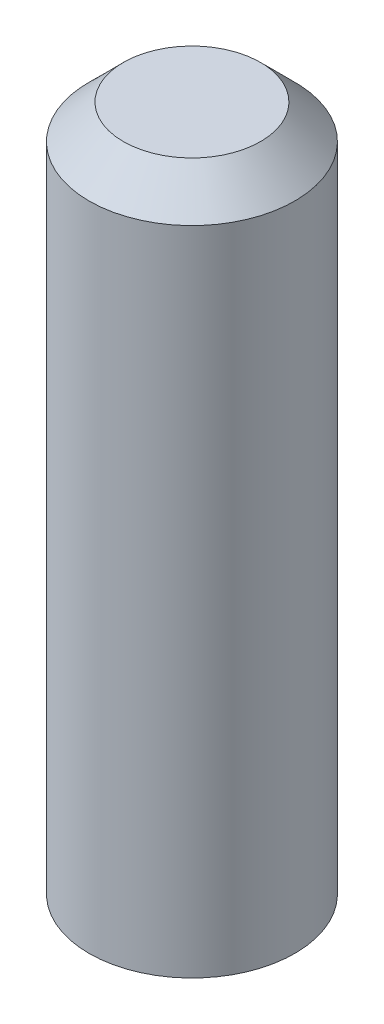
ISO-10303-21;
HEADER;
FILE_DESCRIPTION(('STEP AP214'),'2;1');
FILE_NAME('part.step','',(''),(''),'','','');
FILE_SCHEMA(('AUTOMOTIVE_DESIGN { 1 0 10303 214 1 1 1 1 }'));
ENDSEC;
DATA;
#1=APPLICATION_CONTEXT('core data for automotive mechanical design processes');
#2=APPLICATION_PROTOCOL_DEFINITION('international standard','automotive_design',2000,#1);
#3=PRODUCT_CONTEXT('',#1,'mechanical');
#4=PRODUCT('Part','Part','',(#3));
#5=PRODUCT_RELATED_PRODUCT_CATEGORY('part','',(#4));
#6=PRODUCT_DEFINITION_FORMATION('','',#4);
#7=PRODUCT_DEFINITION_CONTEXT('part definition',#1,'design');
#8=PRODUCT_DEFINITION('design','',#6,#7);
#9=PRODUCT_DEFINITION_SHAPE('','',#8);
#10=(LENGTH_UNIT() NAMED_UNIT(*) SI_UNIT(.MILLI.,.METRE.));
#11=(NAMED_UNIT(*) PLANE_ANGLE_UNIT() SI_UNIT($,.RADIAN.));
#12=(NAMED_UNIT(*) SI_UNIT($,.STERADIAN.) SOLID_ANGLE_UNIT());
#13=UNCERTAINTY_MEASURE_WITH_UNIT(LENGTH_MEASURE(1.E-05),#10,'distance_accuracy_value','');
#14=(GEOMETRIC_REPRESENTATION_CONTEXT(3) GLOBAL_UNCERTAINTY_ASSIGNED_CONTEXT((#13)) GLOBAL_UNIT_ASSIGNED_CONTEXT((#10,
#11,#12)) REPRESENTATION_CONTEXT('',''));
#15=CARTESIAN_POINT('',(0.,0.,0.));
#16=DIRECTION('',(0.,0.,1.));
#17=DIRECTION('',(1.,0.,0.));
#18=AXIS2_PLACEMENT_3D('',#15,#16,#17);
#19=CARTESIAN_POINT('',(0.,10.,0.));
#20=DIRECTION('',(0.,-1.,0.));
#21=DIRECTION('',(0.,0.,-1.));
#22=AXIS2_PLACEMENT_3D('',#19,#20,#21);
#23=CYLINDRICAL_SURFACE('',#22,1.5);
#24=CARTESIAN_POINT('',(0.,9.5,0.));
#25=DIRECTION('',(0.,1.,0.));
#26=DIRECTION('',(0.,0.,1.));
#27=AXIS2_PLACEMENT_3D('',#24,#25,#26);
#28=CIRCLE('',#27,1.5);
#29=CARTESIAN_POINT('',(0.,9.5,1.5));
#30=VERTEX_POINT('',#29);
#31=EDGE_CURVE('E10',#30,#30,#28,.F.);
#32=ORIENTED_EDGE('',*,*,#31,.T.);
#33=EDGE_LOOP('',(#32));
#34=FACE_BOUND('',#33,.T.);
#35=CARTESIAN_POINT('',(0.,0.,0.));
#36=DIRECTION('',(0.,1.,0.));
#37=DIRECTION('',(0.,0.,1.));
#38=AXIS2_PLACEMENT_3D('',#35,#36,#37);
#39=CIRCLE('',#38,1.5);
#40=CARTESIAN_POINT('',(0.,0.,1.5));
#41=VERTEX_POINT('',#40);
#42=EDGE_CURVE('E42',#41,#41,#39,.T.);
#43=ORIENTED_EDGE('',*,*,#42,.T.);
#44=EDGE_LOOP('',(#43));
#45=FACE_BOUND('',#44,.T.);
#46=ADVANCED_FACE('F31',(#34,#45),#23,.T.);
#47=CARTESIAN_POINT('',(0.,10.,0.));
#48=DIRECTION('',(0.,1.,0.));
#49=DIRECTION('',(0.,0.,1.));
#50=AXIS2_PLACEMENT_3D('',#47,#48,#49);
#51=PLANE('',#50);
#52=CARTESIAN_POINT('',(0.,10.,0.));
#53=DIRECTION('',(0.,1.,0.));
#54=DIRECTION('',(0.,0.,1.));
#55=AXIS2_PLACEMENT_3D('',#52,#53,#54);
#56=CIRCLE('',#55,1.);
#57=CARTESIAN_POINT('',(0.,10.,1.));
#58=VERTEX_POINT('',#57);
#59=EDGE_CURVE('E38',#58,#58,#56,.T.);
#60=ORIENTED_EDGE('',*,*,#59,.T.);
#61=EDGE_LOOP('',(#60));
#62=FACE_BOUND('',#61,.T.);
#63=ADVANCED_FACE('F52',(#62),#51,.T.);
#64=CARTESIAN_POINT('',(0.,0.,0.));
#65=DIRECTION('',(0.,1.,0.));
#66=DIRECTION('',(0.,0.,1.));
#67=AXIS2_PLACEMENT_3D('',#64,#65,#66);
#68=PLANE('',#67);
#69=ORIENTED_EDGE('',*,*,#42,.F.);
#70=EDGE_LOOP('',(#69));
#71=FACE_BOUND('',#70,.T.);
#72=ADVANCED_FACE('F50',(#71),#68,.F.);
#73=CARTESIAN_POINT('',(0.,10.,0.));
#74=DIRECTION('',(0.,-1.,0.));
#75=DIRECTION('',(0.,0.,-1.));
#76=AXIS2_PLACEMENT_3D('',#73,#74,#75);
#77=CONICAL_SURFACE('',#76,1.,0.785398163397447);
#78=ORIENTED_EDGE('',*,*,#31,.F.);
#79=EDGE_LOOP('',(#78));
#80=FACE_BOUND('',#79,.T.);
#81=ORIENTED_EDGE('',*,*,#59,.F.);
#82=EDGE_LOOP('',(#81));
#83=FACE_BOUND('',#82,.T.);
#84=ADVANCED_FACE('F33',(#80,#83),#77,.T.);
#85=CLOSED_SHELL('',(#46,#63,#72,#84));
#86=MANIFOLD_SOLID_BREP('B2',#85);
#87=ADVANCED_BREP_SHAPE_REPRESENTATION('',(#18,#86),#14);
#88=SHAPE_DEFINITION_REPRESENTATION(#9,#87);
ENDSEC;
END-ISO-10303-21;
